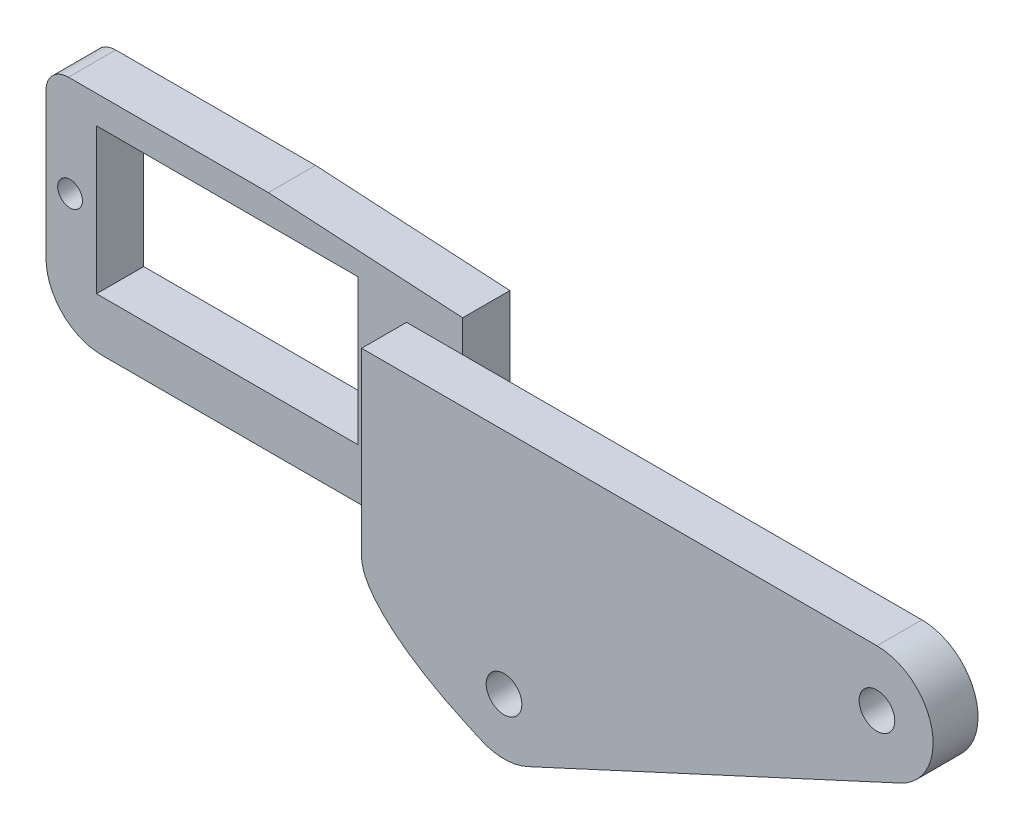
ISO-10303-21;
HEADER;
FILE_DESCRIPTION(('STEP AP214'),'2;1');
FILE_NAME('part.step','',(''),(''),'','','');
FILE_SCHEMA(('AUTOMOTIVE_DESIGN { 1 0 10303 214 1 1 1 1 }'));
ENDSEC;
DATA;
#1=APPLICATION_CONTEXT('core data for automotive mechanical design processes');
#2=APPLICATION_PROTOCOL_DEFINITION('international standard','automotive_design',2000,#1);
#3=PRODUCT_CONTEXT('',#1,'mechanical');
#4=PRODUCT('Part','Part','',(#3));
#5=PRODUCT_RELATED_PRODUCT_CATEGORY('part','',(#4));
#6=PRODUCT_DEFINITION_FORMATION('','',#4);
#7=PRODUCT_DEFINITION_CONTEXT('part definition',#1,'design');
#8=PRODUCT_DEFINITION('design','',#6,#7);
#9=PRODUCT_DEFINITION_SHAPE('','',#8);
#10=(LENGTH_UNIT() NAMED_UNIT(*) SI_UNIT(.MILLI.,.METRE.));
#11=(NAMED_UNIT(*) PLANE_ANGLE_UNIT() SI_UNIT($,.RADIAN.));
#12=(NAMED_UNIT(*) SI_UNIT($,.STERADIAN.) SOLID_ANGLE_UNIT());
#13=UNCERTAINTY_MEASURE_WITH_UNIT(LENGTH_MEASURE(1.E-05),#10,'distance_accuracy_value','');
#14=(GEOMETRIC_REPRESENTATION_CONTEXT(3) GLOBAL_UNCERTAINTY_ASSIGNED_CONTEXT((#13)) GLOBAL_UNIT_ASSIGNED_CONTEXT((#10,
#11,#12)) REPRESENTATION_CONTEXT('',''));
#15=CARTESIAN_POINT('',(0.,0.,0.));
#16=DIRECTION('',(0.,0.,1.));
#17=DIRECTION('',(1.,0.,0.));
#18=AXIS2_PLACEMENT_3D('',#15,#16,#17);
#19=CARTESIAN_POINT('',(-44.44,-11.1,2.50000000000005));
#20=DIRECTION('',(0.,0.,-1.));
#21=DIRECTION('',(1.,0.,0.));
#22=AXIS2_PLACEMENT_3D('',#19,#20,#21);
#23=PLANE('',#22);
#24=CARTESIAN_POINT('',(-14.4900000000001,-0.060000000000001,2.49999999999984));
#25=DIRECTION('',(0.,0.,1.));
#26=DIRECTION('',(1.,0.,0.));
#27=AXIS2_PLACEMENT_3D('',#24,#25,#26);
#28=CIRCLE('',#27,1.1);
#29=CARTESIAN_POINT('',(-13.3900000000001,-0.060000000000001,2.49999999999983));
#30=VERTEX_POINT('',#29);
#31=EDGE_CURVE('E209',#30,#30,#28,.F.);
#32=ORIENTED_EDGE('',*,*,#31,.T.);
#33=EDGE_LOOP('',(#32));
#34=FACE_BOUND('',#33,.T.);
#35=DIRECTION('',(-1.,0.,0.));
#36=VECTOR('',#35,1.);
#37=CARTESIAN_POINT('',(-44.44,8.85,2.50000000000005));
#38=LINE('',#37,#36);
#39=CARTESIAN_POINT('',(-24.64,8.85,2.49999999999991));
#40=VERTEX_POINT('',#39);
#41=CARTESIAN_POINT('',(-42.44,8.85,2.50000000000003));
#42=VERTEX_POINT('',#41);
#43=EDGE_CURVE('E178',#40,#42,#38,.T.);
#44=ORIENTED_EDGE('',*,*,#43,.T.);
#45=CARTESIAN_POINT('',(-42.44,6.85,2.50000000000003));
#46=DIRECTION('',(0.,0.,1.));
#47=DIRECTION('',(1.,0.,0.));
#48=AXIS2_PLACEMENT_3D('',#45,#46,#47);
#49=CIRCLE('',#48,2.);
#50=CARTESIAN_POINT('',(-44.44,6.85,2.50000000000005));
#51=VERTEX_POINT('',#50);
#52=EDGE_CURVE('E12',#51,#42,#49,.F.);
#53=ORIENTED_EDGE('',*,*,#52,.F.);
#54=DIRECTION('',(0.,-1.,0.));
#55=VECTOR('',#54,1.);
#56=CARTESIAN_POINT('',(-44.44,-11.1,2.50000000000005));
#57=LINE('',#56,#55);
#58=CARTESIAN_POINT('',(-44.44,-6.1,2.50000000000005));
#59=VERTEX_POINT('',#58);
#60=EDGE_CURVE('E444',#51,#59,#57,.T.);
#61=ORIENTED_EDGE('',*,*,#60,.T.);
#62=CARTESIAN_POINT('',(-39.44,-6.1,2.50000000000001));
#63=DIRECTION('',(0.,0.,1.));
#64=DIRECTION('',(1.,0.,0.));
#65=AXIS2_PLACEMENT_3D('',#62,#63,#64);
#66=CIRCLE('',#65,5.);
#67=CARTESIAN_POINT('',(-39.44,-11.1,2.50000000000001));
#68=VERTEX_POINT('',#67);
#69=EDGE_CURVE('E351',#68,#59,#66,.F.);
#70=ORIENTED_EDGE('',*,*,#69,.F.);
#71=DIRECTION('',(1.,0.,0.));
#72=VECTOR('',#71,1.);
#73=CARTESIAN_POINT('',(-44.44,-11.1,2.50000000000005));
#74=LINE('',#73,#72);
#75=CARTESIAN_POINT('',(-12.3399999995454,-11.0924387354627,2.49999999999983));
#76=VERTEX_POINT('',#75);
#77=EDGE_CURVE('E242',#68,#76,#74,.T.);
#78=ORIENTED_EDGE('',*,*,#77,.T.);
#79=DIRECTION('',(0.,1.,0.));
#80=VECTOR('',#79,1.);
#81=CARTESIAN_POINT('',(-12.34,-11.1,2.49999999999983));
#82=LINE('',#81,#80);
#83=CARTESIAN_POINT('',(-12.34,5.,2.49999999999985));
#84=VERTEX_POINT('',#83);
#85=EDGE_CURVE('E213',#76,#84,#82,.T.);
#86=ORIENTED_EDGE('',*,*,#85,.T.);
#87=DIRECTION('',(-1.,0.,0.));
#88=VECTOR('',#87,1.);
#89=CARTESIAN_POINT('',(-33.54,5.,2.5));
#90=LINE('',#89,#88);
#91=CARTESIAN_POINT('',(-7.34000000000002,5.,2.49999999999979));
#92=VERTEX_POINT('',#91);
#93=EDGE_CURVE('E402',#92,#84,#90,.T.);
#94=ORIENTED_EDGE('',*,*,#93,.F.);
#95=DIRECTION('',(0.,1.,0.));
#96=VECTOR('',#95,1.);
#97=CARTESIAN_POINT('',(-7.34000000000002,-11.1,2.49999999999979));
#98=LINE('',#97,#96);
#99=CARTESIAN_POINT('',(-7.34000000000005,7.85,2.49999999999979));
#100=VERTEX_POINT('',#99);
#101=EDGE_CURVE('E496',#92,#100,#98,.T.);
#102=ORIENTED_EDGE('',*,*,#101,.T.);
#103=DIRECTION('',(-0.998333554368019,0.0577071418709838,0.));
#104=VECTOR('',#103,1.);
#105=CARTESIAN_POINT('',(-7.34000000000008,7.85,2.49999999999979));
#106=LINE('',#105,#104);
#107=EDGE_CURVE('E193',#100,#40,#106,.T.);
#108=ORIENTED_EDGE('',*,*,#107,.T.);
#109=EDGE_LOOP('',(#44,#53,#61,#70,#78,#86,#94,#102,#108));
#110=FACE_BOUND('',#109,.T.);
#111=DIRECTION('',(1.,0.,0.));
#112=VECTOR('',#111,1.);
#113=CARTESIAN_POINT('',(-39.94,6.35,2.50000000000002));
#114=LINE('',#113,#112);
#115=CARTESIAN_POINT('',(-39.9400000000001,6.35,2.50000000000002));
#116=VERTEX_POINT('',#115);
#117=CARTESIAN_POINT('',(-16.64,6.35,2.49999999999985));
#118=VERTEX_POINT('',#117);
#119=EDGE_CURVE('E484',#116,#118,#114,.T.);
#120=ORIENTED_EDGE('',*,*,#119,.T.);
#121=DIRECTION('',(0.,-1.,0.));
#122=VECTOR('',#121,1.);
#123=CARTESIAN_POINT('',(-16.64,6.35,2.49999999999985));
#124=LINE('',#123,#122);
#125=CARTESIAN_POINT('',(-16.64,-6.6,2.49999999999985));
#126=VERTEX_POINT('',#125);
#127=EDGE_CURVE('E480',#118,#126,#124,.T.);
#128=ORIENTED_EDGE('',*,*,#127,.T.);
#129=DIRECTION('',(-1.,0.,0.));
#130=VECTOR('',#129,1.);
#131=CARTESIAN_POINT('',(-39.94,-6.6,2.50000000000002));
#132=LINE('',#131,#130);
#133=CARTESIAN_POINT('',(-39.94,-6.6,2.50000000000002));
#134=VERTEX_POINT('',#133);
#135=EDGE_CURVE('E476',#126,#134,#132,.T.);
#136=ORIENTED_EDGE('',*,*,#135,.T.);
#137=DIRECTION('',(0.,1.,0.));
#138=VECTOR('',#137,1.);
#139=CARTESIAN_POINT('',(-39.94,6.35,2.50000000000002));
#140=LINE('',#139,#138);
#141=EDGE_CURVE('E488',#134,#116,#140,.T.);
#142=ORIENTED_EDGE('',*,*,#141,.T.);
#143=EDGE_LOOP('',(#120,#128,#136,#142));
#144=FACE_BOUND('',#143,.T.);
#145=CARTESIAN_POINT('',(-42.3000000000001,-0.060000000000001,2.50000000000003));
#146=DIRECTION('',(0.,0.,1.));
#147=DIRECTION('',(1.,0.,0.));
#148=AXIS2_PLACEMENT_3D('',#145,#146,#147);
#149=CIRCLE('',#148,1.1);
#150=CARTESIAN_POINT('',(-41.2000000000001,-0.060000000000001,2.50000000000002));
#151=VERTEX_POINT('',#150);
#152=EDGE_CURVE('E201',#151,#151,#149,.F.);
#153=ORIENTED_EDGE('',*,*,#152,.T.);
#154=EDGE_LOOP('',(#153));
#155=FACE_BOUND('',#154,.T.);
#156=ADVANCED_FACE('F45',(#34,#110,#144,#155),#23,.F.);
#157=CARTESIAN_POINT('',(-33.54,0.,2.5));
#158=DIRECTION('',(0.,0.,-1.));
#159=DIRECTION('',(1.,0.,0.));
#160=AXIS2_PLACEMENT_3D('',#157,#158,#159);
#161=PLANE('',#160);
#162=CARTESIAN_POINT('',(0.338098725402507,-15.3296657416879,2.5));
#163=DIRECTION('',(0.,0.,1.));
#164=DIRECTION('',(1.,0.,0.));
#165=AXIS2_PLACEMENT_3D('',#162,#163,#164);
#166=CIRCLE('',#165,1.5875);
#167=CARTESIAN_POINT('',(1.92559872540251,-15.3296657416879,2.5));
#168=VERTEX_POINT('',#167);
#169=EDGE_CURVE('E433',#168,#168,#166,.T.);
#170=ORIENTED_EDGE('',*,*,#169,.T.);
#171=EDGE_LOOP('',(#170));
#172=FACE_BOUND('',#171,.T.);
#173=CARTESIAN_POINT('',(33.54,0.,2.5));
#174=DIRECTION('',(0.,0.,1.));
#175=DIRECTION('',(1.,0.,0.));
#176=AXIS2_PLACEMENT_3D('',#173,#174,#175);
#177=CIRCLE('',#176,1.5875);
#178=CARTESIAN_POINT('',(35.1275,0.,2.5));
#179=VERTEX_POINT('',#178);
#180=EDGE_CURVE('E425',#179,#179,#177,.T.);
#181=ORIENTED_EDGE('',*,*,#180,.T.);
#182=EDGE_LOOP('',(#181));
#183=FACE_BOUND('',#182,.T.);
#184=CARTESIAN_POINT('',(-7.34000000000002,-11.1,2.49999999999979));
#185=VERTEX_POINT('',#184);
#186=EDGE_CURVE('E366',#76,#185,#74,.T.);
#187=ORIENTED_EDGE('',*,*,#186,.T.);
#188=EDGE_CURVE('E492',#185,#92,#98,.T.);
#189=ORIENTED_EDGE('',*,*,#188,.T.);
#190=CARTESIAN_POINT('',(33.54,5.,2.5));
#191=VERTEX_POINT('',#190);
#192=EDGE_CURVE('E399',#191,#92,#90,.T.);
#193=ORIENTED_EDGE('',*,*,#192,.F.);
#194=CARTESIAN_POINT('',(33.54,0.,2.5));
#195=DIRECTION('',(0.,0.,1.));
#196=DIRECTION('',(-1.,0.,0.));
#197=AXIS2_PLACEMENT_3D('',#194,#195,#196);
#198=CIRCLE('',#197,5.);
#199=CARTESIAN_POINT('',(35.6359346105671,-4.53949976409591,2.5));
#200=VERTEX_POINT('',#199);
#201=EDGE_CURVE('E406',#200,#191,#198,.T.);
#202=ORIENTED_EDGE('',*,*,#201,.F.);
#203=DIRECTION('',(0.907899952819182,0.419186922113425,0.));
#204=VECTOR('',#203,1.);
#205=CARTESIAN_POINT('',(2.43403333596963,-19.8691655057838,2.5));
#206=LINE('',#205,#204);
#207=CARTESIAN_POINT('',(2.43403333596963,-19.8691655057838,2.5));
#208=VERTEX_POINT('',#207);
#209=EDGE_CURVE('E409',#208,#200,#206,.T.);
#210=ORIENTED_EDGE('',*,*,#209,.F.);
#211=CARTESIAN_POINT('',(0.338098725402507,-15.3296657416879,2.5));
#212=DIRECTION('',(0.,0.,1.));
#213=DIRECTION('',(1.,0.,0.));
#214=AXIS2_PLACEMENT_3D('',#211,#212,#213);
#215=CIRCLE('',#214,5.);
#216=CARTESIAN_POINT('',(-1.72317137567157,-19.8850104674379,2.5));
#217=VERTEX_POINT('',#216);
#218=EDGE_CURVE('E413',#217,#208,#215,.T.);
#219=ORIENTED_EDGE('',*,*,#218,.F.);
#220=DIRECTION('',(0.911068945149994,-0.412254020214816,0.));
#221=VECTOR('',#220,1.);
#222=CARTESIAN_POINT('',(-1.72317137567157,-19.8850104674379,2.5));
#223=LINE('',#222,#221);
#224=CARTESIAN_POINT('',(-3.05028618193337,-19.2844978310666,2.5));
#225=VERTEX_POINT('',#224);
#226=EDGE_CURVE('E417',#225,#217,#223,.T.);
#227=ORIENTED_EDGE('',*,*,#226,.F.);
#228=CARTESIAN_POINT('',(-12.34,-11.0848773247167,2.50000000000005));
#229=CARTESIAN_POINT('',(-12.34,-15.0809500221655,2.50000000000003));
#230=CARTESIAN_POINT('',(-3.05028618193337,-19.2844978310666,2.49999999999995));
#231=(BOUNDED_CURVE() B_SPLINE_CURVE(2,(#228,#229,#230),.UNSPECIFIED.,.F.,
.F.) B_SPLINE_CURVE_WITH_KNOTS((3,3),(0.,1.),
.UNSPECIFIED.) CURVE() GEOMETRIC_REPRESENTATION_ITEM() RATIONAL_B_SPLINE_CURVE((1.,
0.840313637939673,1.)) REPRESENTATION_ITEM(''));
#232=EDGE_CURVE('E340',#76,#225,#231,.T.);
#233=ORIENTED_EDGE('',*,*,#232,.F.);
#234=EDGE_LOOP('',(#187,#189,#193,#202,#210,#219,#227,#233));
#235=FACE_BOUND('',#234,.T.);
#236=ADVANCED_FACE('F258',(#172,#183,#235),#161,.T.);
#237=CARTESIAN_POINT('',(-33.54,5.,6.5));
#238=DIRECTION('',(0.,1.,0.));
#239=DIRECTION('',(0.,0.,-1.));
#240=AXIS2_PLACEMENT_3D('',#237,#238,#239);
#241=PLANE('',#240);
#242=DIRECTION('',(-1.,0.,0.));
#243=VECTOR('',#242,1.);
#244=CARTESIAN_POINT('',(-33.54,5.,6.5));
#245=LINE('',#244,#243);
#246=CARTESIAN_POINT('',(33.54,5.,6.5));
#247=VERTEX_POINT('',#246);
#248=CARTESIAN_POINT('',(-12.34,5.,6.49999999999985));
#249=VERTEX_POINT('',#248);
#250=EDGE_CURVE('E381',#247,#249,#245,.T.);
#251=ORIENTED_EDGE('',*,*,#250,.F.);
#252=DIRECTION('',(0.,0.,-1.));
#253=VECTOR('',#252,1.);
#254=CARTESIAN_POINT('',(33.54,5.,6.5));
#255=LINE('',#254,#253);
#256=EDGE_CURVE('E369',#247,#191,#255,.T.);
#257=ORIENTED_EDGE('',*,*,#256,.T.);
#258=ORIENTED_EDGE('',*,*,#192,.T.);
#259=ORIENTED_EDGE('',*,*,#93,.T.);
#260=DIRECTION('',(0.,0.,1.));
#261=VECTOR('',#260,1.);
#262=CARTESIAN_POINT('',(-12.34,5.,2.49999999999985));
#263=LINE('',#262,#261);
#264=EDGE_CURVE('E219',#84,#249,#263,.T.);
#265=ORIENTED_EDGE('',*,*,#264,.T.);
#266=EDGE_LOOP('',(#251,#257,#258,#259,#265));
#267=FACE_BOUND('',#266,.T.);
#268=ADVANCED_FACE('F261',(#267),#241,.T.);
#269=CARTESIAN_POINT('',(-1.72317137567157,-19.8850104674379,6.5));
#270=DIRECTION('',(-0.412254020214816,-0.911068945149994,0.));
#271=DIRECTION('',(0.911068945149994,-0.412254020214816,0.));
#272=AXIS2_PLACEMENT_3D('',#269,#270,#271);
#273=PLANE('',#272);
#274=ORIENTED_EDGE('',*,*,#226,.T.);
#275=DIRECTION('',(0.,0.,-1.));
#276=VECTOR('',#275,1.);
#277=CARTESIAN_POINT('',(-1.72317137567157,-19.8850104674379,6.5));
#278=LINE('',#277,#276);
#279=CARTESIAN_POINT('',(-1.72317137567157,-19.8850104674379,6.5));
#280=VERTEX_POINT('',#279);
#281=EDGE_CURVE('E378',#280,#217,#278,.T.);
#282=ORIENTED_EDGE('',*,*,#281,.F.);
#283=DIRECTION('',(0.911068945149994,-0.412254020214816,0.));
#284=VECTOR('',#283,1.);
#285=CARTESIAN_POINT('',(-1.72317137567157,-19.8850104674379,6.5));
#286=LINE('',#285,#284);
#287=CARTESIAN_POINT('',(-3.05028618193334,-19.2844978310666,6.5));
#288=VERTEX_POINT('',#287);
#289=EDGE_CURVE('E396',#288,#280,#286,.T.);
#290=ORIENTED_EDGE('',*,*,#289,.F.);
#291=CARTESIAN_POINT('',(-3.05028618193337,-19.2844978310666,2.29999999999972));
#292=CARTESIAN_POINT('',(-3.05028618193337,-19.2844978310666,3.76666666666648));
#293=CARTESIAN_POINT('',(-3.05028618193334,-19.2844978310666,5.23333333333325));
#294=CARTESIAN_POINT('',(-3.05028618193334,-19.2844978310666,6.70000000000001));
#295=(BOUNDED_CURVE() B_SPLINE_CURVE(3,(#291,#292,#293,#294),.UNSPECIFIED.,.F.,
.F.) B_SPLINE_CURVE_WITH_KNOTS((4,4),(-0.00420000000000029,0.000200000000000002),
.UNSPECIFIED.) CURVE() GEOMETRIC_REPRESENTATION_ITEM() RATIONAL_B_SPLINE_CURVE((1.,1.,1.,1.)) REPRESENTATION_ITEM(''));
#296=EDGE_CURVE('E349',#225,#288,#295,.T.);
#297=ORIENTED_EDGE('',*,*,#296,.F.);
#298=EDGE_LOOP('',(#274,#282,#290,#297));
#299=FACE_BOUND('',#298,.T.);
#300=ADVANCED_FACE('F256',(#299),#273,.T.);
#301=CARTESIAN_POINT('',(-33.54,0.,6.5));
#302=DIRECTION('',(0.,0.,-1.));
#303=DIRECTION('',(1.,0.,0.));
#304=AXIS2_PLACEMENT_3D('',#301,#302,#303);
#305=PLANE('',#304);
#306=CARTESIAN_POINT('',(33.54,0.,6.5));
#307=DIRECTION('',(0.,0.,1.));
#308=DIRECTION('',(1.,0.,0.));
#309=AXIS2_PLACEMENT_3D('',#306,#307,#308);
#310=CIRCLE('',#309,1.5875);
#311=CARTESIAN_POINT('',(35.1275,0.,6.5));
#312=VERTEX_POINT('',#311);
#313=EDGE_CURVE('E421',#312,#312,#310,.T.);
#314=ORIENTED_EDGE('',*,*,#313,.F.);
#315=EDGE_LOOP('',(#314));
#316=FACE_BOUND('',#315,.T.);
#317=CARTESIAN_POINT('',(0.338098725402507,-15.3296657416879,6.5));
#318=DIRECTION('',(0.,0.,1.));
#319=DIRECTION('',(1.,0.,0.));
#320=AXIS2_PLACEMENT_3D('',#317,#318,#319);
#321=CIRCLE('',#320,1.5875);
#322=CARTESIAN_POINT('',(1.92559872540251,-15.3296657416879,6.5));
#323=VERTEX_POINT('',#322);
#324=EDGE_CURVE('E429',#323,#323,#321,.T.);
#325=ORIENTED_EDGE('',*,*,#324,.F.);
#326=EDGE_LOOP('',(#325));
#327=FACE_BOUND('',#326,.T.);
#328=ORIENTED_EDGE('',*,*,#289,.T.);
#329=CARTESIAN_POINT('',(0.338098725402507,-15.3296657416879,6.5));
#330=DIRECTION('',(0.,0.,1.));
#331=DIRECTION('',(1.,0.,0.));
#332=AXIS2_PLACEMENT_3D('',#329,#330,#331);
#333=CIRCLE('',#332,5.);
#334=CARTESIAN_POINT('',(2.43403333596963,-19.8691655057838,6.5));
#335=VERTEX_POINT('',#334);
#336=EDGE_CURVE('E392',#280,#335,#333,.T.);
#337=ORIENTED_EDGE('',*,*,#336,.T.);
#338=DIRECTION('',(0.907899952819182,0.419186922113425,0.));
#339=VECTOR('',#338,1.);
#340=CARTESIAN_POINT('',(2.43403333596963,-19.8691655057838,6.5));
#341=LINE('',#340,#339);
#342=CARTESIAN_POINT('',(35.6359346105671,-4.53949976409591,6.5));
#343=VERTEX_POINT('',#342);
#344=EDGE_CURVE('E388',#335,#343,#341,.T.);
#345=ORIENTED_EDGE('',*,*,#344,.T.);
#346=CARTESIAN_POINT('',(33.54,0.,6.5));
#347=DIRECTION('',(0.,0.,1.));
#348=DIRECTION('',(-1.,0.,0.));
#349=AXIS2_PLACEMENT_3D('',#346,#347,#348);
#350=CIRCLE('',#349,5.);
#351=EDGE_CURVE('E385',#343,#247,#350,.T.);
#352=ORIENTED_EDGE('',*,*,#351,.T.);
#353=ORIENTED_EDGE('',*,*,#250,.T.);
#354=DIRECTION('',(0.,-1.,0.));
#355=VECTOR('',#354,1.);
#356=CARTESIAN_POINT('',(-12.34,5.,6.49999999999985));
#357=LINE('',#356,#355);
#358=CARTESIAN_POINT('',(-12.34,-11.0848773247167,6.49999999999996));
#359=VERTEX_POINT('',#358);
#360=EDGE_CURVE('E222',#249,#359,#357,.T.);
#361=ORIENTED_EDGE('',*,*,#360,.T.);
#362=CARTESIAN_POINT('',(-3.05028618193334,-19.2844978310666,6.49999999999996));
#363=CARTESIAN_POINT('',(-12.34,-15.0809500221655,6.50000000000003));
#364=CARTESIAN_POINT('',(-12.34,-11.0848773247167,6.50000000000004));
#365=(BOUNDED_CURVE() B_SPLINE_CURVE(2,(#362,#363,#364),.UNSPECIFIED.,.F.,
.F.) B_SPLINE_CURVE_WITH_KNOTS((3,3),(0.,1.),
.UNSPECIFIED.) CURVE() GEOMETRIC_REPRESENTATION_ITEM() RATIONAL_B_SPLINE_CURVE((1.,
0.840313637939673,1.)) REPRESENTATION_ITEM(''));
#366=EDGE_CURVE('E236',#288,#359,#365,.T.);
#367=ORIENTED_EDGE('',*,*,#366,.F.);
#368=EDGE_LOOP('',(#328,#337,#345,#352,#353,#361,#367));
#369=FACE_BOUND('',#368,.T.);
#370=ADVANCED_FACE('F245',(#316,#327,#369),#305,.F.);
#371=CARTESIAN_POINT('',(33.54,0.,6.5));
#372=DIRECTION('',(0.,0.,-1.));
#373=DIRECTION('',(1.,0.,0.));
#374=AXIS2_PLACEMENT_3D('',#371,#372,#373);
#375=CYLINDRICAL_SURFACE('',#374,5.);
#376=ORIENTED_EDGE('',*,*,#256,.F.);
#377=ORIENTED_EDGE('',*,*,#351,.F.);
#378=DIRECTION('',(0.,0.,-1.));
#379=VECTOR('',#378,1.);
#380=CARTESIAN_POINT('',(35.6359346105671,-4.53949976409591,6.5));
#381=LINE('',#380,#379);
#382=EDGE_CURVE('E372',#343,#200,#381,.T.);
#383=ORIENTED_EDGE('',*,*,#382,.T.);
#384=ORIENTED_EDGE('',*,*,#201,.T.);
#385=EDGE_LOOP('',(#376,#377,#383,#384));
#386=FACE_BOUND('',#385,.T.);
#387=ADVANCED_FACE('F255',(#386),#375,.T.);
#388=CARTESIAN_POINT('',(2.43403333596963,-19.8691655057838,6.5));
#389=DIRECTION('',(0.419186922113425,-0.907899952819183,0.));
#390=DIRECTION('',(0.907899952819183,0.419186922113425,0.));
#391=AXIS2_PLACEMENT_3D('',#388,#389,#390);
#392=PLANE('',#391);
#393=ORIENTED_EDGE('',*,*,#382,.F.);
#394=ORIENTED_EDGE('',*,*,#344,.F.);
#395=DIRECTION('',(0.,0.,-1.));
#396=VECTOR('',#395,1.);
#397=CARTESIAN_POINT('',(2.43403333596963,-19.8691655057838,6.5));
#398=LINE('',#397,#396);
#399=EDGE_CURVE('E375',#335,#208,#398,.T.);
#400=ORIENTED_EDGE('',*,*,#399,.T.);
#401=ORIENTED_EDGE('',*,*,#209,.T.);
#402=EDGE_LOOP('',(#393,#394,#400,#401));
#403=FACE_BOUND('',#402,.T.);
#404=ADVANCED_FACE('F267',(#403),#392,.T.);
#405=CARTESIAN_POINT('',(0.338098725402507,-15.3296657416879,6.5));
#406=DIRECTION('',(0.,0.,-1.));
#407=DIRECTION('',(1.,0.,0.));
#408=AXIS2_PLACEMENT_3D('',#405,#406,#407);
#409=CYLINDRICAL_SURFACE('',#408,5.);
#410=ORIENTED_EDGE('',*,*,#399,.F.);
#411=ORIENTED_EDGE('',*,*,#336,.F.);
#412=ORIENTED_EDGE('',*,*,#281,.T.);
#413=ORIENTED_EDGE('',*,*,#218,.T.);
#414=EDGE_LOOP('',(#410,#411,#412,#413));
#415=FACE_BOUND('',#414,.T.);
#416=ADVANCED_FACE('F271',(#415),#409,.T.);
#417=CARTESIAN_POINT('',(0.338098725402507,-15.3296657416879,6.5));
#418=DIRECTION('',(0.,0.,-1.));
#419=DIRECTION('',(1.,0.,0.));
#420=AXIS2_PLACEMENT_3D('',#417,#418,#419);
#421=CYLINDRICAL_SURFACE('',#420,1.5875);
#422=ORIENTED_EDGE('',*,*,#324,.T.);
#423=EDGE_LOOP('',(#422));
#424=FACE_BOUND('',#423,.T.);
#425=ORIENTED_EDGE('',*,*,#169,.F.);
#426=EDGE_LOOP('',(#425));
#427=FACE_BOUND('',#426,.T.);
#428=ADVANCED_FACE('F274',(#424,#427),#421,.F.);
#429=CARTESIAN_POINT('',(33.54,0.,6.5));
#430=DIRECTION('',(0.,0.,-1.));
#431=DIRECTION('',(1.,0.,0.));
#432=AXIS2_PLACEMENT_3D('',#429,#430,#431);
#433=CYLINDRICAL_SURFACE('',#432,1.5875);
#434=ORIENTED_EDGE('',*,*,#313,.T.);
#435=EDGE_LOOP('',(#434));
#436=FACE_BOUND('',#435,.T.);
#437=ORIENTED_EDGE('',*,*,#180,.F.);
#438=EDGE_LOOP('',(#437));
#439=FACE_BOUND('',#438,.T.);
#440=ADVANCED_FACE('F587',(#436,#439),#433,.F.);
#441=CARTESIAN_POINT('',(-44.44,-11.1,2.50000000000005));
#442=DIRECTION('',(0.,1.,0.));
#443=DIRECTION('',(-1.,0.,0.));
#444=AXIS2_PLACEMENT_3D('',#441,#442,#443);
#445=PLANE('',#444);
#446=DIRECTION('',(1.,0.,0.));
#447=VECTOR('',#446,1.);
#448=CARTESIAN_POINT('',(-44.4400000000001,-11.1,-1.69999999999995));
#449=LINE('',#448,#447);
#450=CARTESIAN_POINT('',(-39.4400000000001,-11.1,-1.69999999999999));
#451=VERTEX_POINT('',#450);
#452=CARTESIAN_POINT('',(-7.34000000000005,-11.1,-1.70000000000021));
#453=VERTEX_POINT('',#452);
#454=EDGE_CURVE('E437',#451,#453,#449,.T.);
#455=ORIENTED_EDGE('',*,*,#454,.T.);
#456=DIRECTION('',(0.,0.,1.));
#457=VECTOR('',#456,1.);
#458=CARTESIAN_POINT('',(-7.34000000000005,-11.1,-1.70000000000021));
#459=LINE('',#458,#457);
#460=EDGE_CURVE('E500',#453,#185,#459,.T.);
#461=ORIENTED_EDGE('',*,*,#460,.T.);
#462=ORIENTED_EDGE('',*,*,#186,.F.);
#463=ORIENTED_EDGE('',*,*,#77,.F.);
#464=DIRECTION('',(0.,0.,-1.));
#465=VECTOR('',#464,1.);
#466=CARTESIAN_POINT('',(-39.44,-11.1,2.50000000000001));
#467=LINE('',#466,#465);
#468=EDGE_CURVE('E354',#451,#68,#467,.F.);
#469=ORIENTED_EDGE('',*,*,#468,.F.);
#470=EDGE_LOOP('',(#455,#461,#462,#463,#469));
#471=FACE_BOUND('',#470,.T.);
#472=ADVANCED_FACE('F583',(#471),#445,.F.);
#473=CARTESIAN_POINT('',(-44.4400000000001,-11.1,-1.69999999999995));
#474=DIRECTION('',(0.,0.,1.));
#475=DIRECTION('',(-1.,0.,0.));
#476=AXIS2_PLACEMENT_3D('',#473,#474,#475);
#477=PLANE('',#476);
#478=CARTESIAN_POINT('',(-42.3000000000001,-0.060000000000001,-1.70000000000026));
#479=DIRECTION('',(0.,0.,1.));
#480=DIRECTION('',(1.,0.,0.));
#481=AXIS2_PLACEMENT_3D('',#478,#479,#480);
#482=CIRCLE('',#481,1.1);
#483=CARTESIAN_POINT('',(-41.2000000000001,-0.060000000000001,-1.70000000000026));
#484=VERTEX_POINT('',#483);
#485=EDGE_CURVE('E197',#484,#484,#482,.T.);
#486=ORIENTED_EDGE('',*,*,#485,.T.);
#487=EDGE_LOOP('',(#486));
#488=FACE_BOUND('',#487,.T.);
#489=CARTESIAN_POINT('',(-14.4900000000001,-0.060000000000001,-1.70000000000026));
#490=DIRECTION('',(0.,0.,1.));
#491=DIRECTION('',(1.,0.,0.));
#492=AXIS2_PLACEMENT_3D('',#489,#490,#491);
#493=CIRCLE('',#492,1.1);
#494=CARTESIAN_POINT('',(-13.3900000000001,-0.060000000000001,-1.70000000000026));
#495=VERTEX_POINT('',#494);
#496=EDGE_CURVE('E205',#495,#495,#493,.T.);
#497=ORIENTED_EDGE('',*,*,#496,.T.);
#498=EDGE_LOOP('',(#497));
#499=FACE_BOUND('',#498,.T.);
#500=DIRECTION('',(1.,0.,0.));
#501=VECTOR('',#500,1.);
#502=CARTESIAN_POINT('',(-39.9400000000001,-6.6,-1.69999999999998));
#503=LINE('',#502,#501);
#504=CARTESIAN_POINT('',(-39.9400000000003,-6.6,-1.69999999999998));
#505=VERTEX_POINT('',#504);
#506=CARTESIAN_POINT('',(-16.6400000000001,-6.6,-1.70000000000015));
#507=VERTEX_POINT('',#506);
#508=EDGE_CURVE('E456',#505,#507,#503,.T.);
#509=ORIENTED_EDGE('',*,*,#508,.T.);
#510=DIRECTION('',(0.,1.,0.));
#511=VECTOR('',#510,1.);
#512=CARTESIAN_POINT('',(-16.6400000000001,6.35,-1.70000000000015));
#513=LINE('',#512,#511);
#514=CARTESIAN_POINT('',(-16.64,6.35,-1.70000000000015));
#515=VERTEX_POINT('',#514);
#516=EDGE_CURVE('E460',#507,#515,#513,.T.);
#517=ORIENTED_EDGE('',*,*,#516,.T.);
#518=DIRECTION('',(-1.,0.,0.));
#519=VECTOR('',#518,1.);
#520=CARTESIAN_POINT('',(-39.9400000000001,6.35,-1.69999999999998));
#521=LINE('',#520,#519);
#522=CARTESIAN_POINT('',(-39.9400000000003,6.35,-1.69999999999998));
#523=VERTEX_POINT('',#522);
#524=EDGE_CURVE('E448',#515,#523,#521,.T.);
#525=ORIENTED_EDGE('',*,*,#524,.T.);
#526=DIRECTION('',(0.,-1.,0.));
#527=VECTOR('',#526,1.);
#528=CARTESIAN_POINT('',(-39.9400000000001,6.35,-1.69999999999998));
#529=LINE('',#528,#527);
#530=EDGE_CURVE('E452',#523,#505,#529,.T.);
#531=ORIENTED_EDGE('',*,*,#530,.T.);
#532=EDGE_LOOP('',(#509,#517,#525,#531));
#533=FACE_BOUND('',#532,.T.);
#534=DIRECTION('',(0.,-1.,0.));
#535=VECTOR('',#534,1.);
#536=CARTESIAN_POINT('',(-7.34000000000005,-11.1,-1.70000000000021));
#537=LINE('',#536,#535);
#538=CARTESIAN_POINT('',(-7.34000000000005,7.85,-1.70000000000026));
#539=VERTEX_POINT('',#538);
#540=EDGE_CURVE('E227',#539,#453,#537,.T.);
#541=ORIENTED_EDGE('',*,*,#540,.T.);
#542=ORIENTED_EDGE('',*,*,#454,.F.);
#543=CARTESIAN_POINT('',(-39.4400000000001,-6.1,-1.69999999999999));
#544=DIRECTION('',(0.,0.,-1.));
#545=DIRECTION('',(-1.,0.,0.));
#546=AXIS2_PLACEMENT_3D('',#543,#544,#545);
#547=CIRCLE('',#546,5.);
#548=CARTESIAN_POINT('',(-44.4400000000001,-6.1,-1.69999999999995));
#549=VERTEX_POINT('',#548);
#550=EDGE_CURVE('E357',#549,#451,#547,.F.);
#551=ORIENTED_EDGE('',*,*,#550,.F.);
#552=DIRECTION('',(0.,1.,0.));
#553=VECTOR('',#552,1.);
#554=CARTESIAN_POINT('',(-44.4400000000001,-11.1,-1.69999999999995));
#555=LINE('',#554,#553);
#556=CARTESIAN_POINT('',(-44.4400000000001,6.85,-1.69999999999995));
#557=VERTEX_POINT('',#556);
#558=EDGE_CURVE('E441',#549,#557,#555,.T.);
#559=ORIENTED_EDGE('',*,*,#558,.T.);
#560=CARTESIAN_POINT('',(-42.44,6.85,-1.69999999999997));
#561=DIRECTION('',(0.,0.,-1.));
#562=DIRECTION('',(-1.,0.,0.));
#563=AXIS2_PLACEMENT_3D('',#560,#561,#562);
#564=CIRCLE('',#563,2.);
#565=CARTESIAN_POINT('',(-42.44,8.85,-1.70000000000026));
#566=VERTEX_POINT('',#565);
#567=EDGE_CURVE('E191',#566,#557,#564,.F.);
#568=ORIENTED_EDGE('',*,*,#567,.F.);
#569=DIRECTION('',(1.,0.,0.));
#570=VECTOR('',#569,1.);
#571=CARTESIAN_POINT('',(-44.4400000000001,8.85,-1.70000000000026));
#572=LINE('',#571,#570);
#573=CARTESIAN_POINT('',(-24.64,8.85,-1.70000000000026));
#574=VERTEX_POINT('',#573);
#575=EDGE_CURVE('E175',#566,#574,#572,.T.);
#576=ORIENTED_EDGE('',*,*,#575,.T.);
#577=DIRECTION('',(0.998333554368019,-0.0577071418709838,0.));
#578=VECTOR('',#577,1.);
#579=CARTESIAN_POINT('',(-7.34000000000005,7.85,-1.70000000000026));
#580=LINE('',#579,#578);
#581=EDGE_CURVE('E181',#574,#539,#580,.T.);
#582=ORIENTED_EDGE('',*,*,#581,.T.);
#583=EDGE_LOOP('',(#541,#542,#551,#559,#568,#576,#582));
#584=FACE_BOUND('',#583,.T.);
#585=ADVANCED_FACE('F189',(#488,#499,#533,#584),#477,.F.);
#586=CARTESIAN_POINT('',(-44.44,0.,5.00000000000031));
#587=DIRECTION('',(1.,0.,0.));
#588=DIRECTION('',(0.,0.,1.));
#589=AXIS2_PLACEMENT_3D('',#586,#587,#588);
#590=PLANE('',#589);
#591=ORIENTED_EDGE('',*,*,#558,.F.);
#592=DIRECTION('',(0.,0.,-1.));
#593=VECTOR('',#592,1.);
#594=CARTESIAN_POINT('',(-44.44,-6.1,5.00000000000031));
#595=LINE('',#594,#593);
#596=EDGE_CURVE('E360',#59,#549,#595,.T.);
#597=ORIENTED_EDGE('',*,*,#596,.F.);
#598=ORIENTED_EDGE('',*,*,#60,.F.);
#599=DIRECTION('',(0.,0.,-1.));
#600=VECTOR('',#599,1.);
#601=CARTESIAN_POINT('',(-44.44,6.85,5.00000000000031));
#602=LINE('',#601,#600);
#603=EDGE_CURVE('E53',#557,#51,#602,.F.);
#604=ORIENTED_EDGE('',*,*,#603,.F.);
#605=EDGE_LOOP('',(#591,#597,#598,#604));
#606=FACE_BOUND('',#605,.T.);
#607=ADVANCED_FACE('F576',(#606),#590,.F.);
#608=CARTESIAN_POINT('',(-39.9400000000003,6.35,-28.3569409347734));
#609=DIRECTION('',(-1.,0.,0.));
#610=DIRECTION('',(0.,0.,-1.));
#611=AXIS2_PLACEMENT_3D('',#608,#609,#610);
#612=PLANE('',#611);
#613=ORIENTED_EDGE('',*,*,#530,.F.);
#614=DIRECTION('',(0.,0.,1.));
#615=VECTOR('',#614,1.);
#616=CARTESIAN_POINT('',(-39.9400000000003,6.35,-28.3569409347734));
#617=LINE('',#616,#615);
#618=EDGE_CURVE('E473',#523,#116,#617,.T.);
#619=ORIENTED_EDGE('',*,*,#618,.T.);
#620=ORIENTED_EDGE('',*,*,#141,.F.);
#621=DIRECTION('',(0.,0.,1.));
#622=VECTOR('',#621,1.);
#623=CARTESIAN_POINT('',(-39.9400000000003,-6.6,-28.3569409347734));
#624=LINE('',#623,#622);
#625=EDGE_CURVE('E464',#505,#134,#624,.T.);
#626=ORIENTED_EDGE('',*,*,#625,.F.);
#627=EDGE_LOOP('',(#613,#619,#620,#626));
#628=FACE_BOUND('',#627,.T.);
#629=ADVANCED_FACE('F566',(#628),#612,.F.);
#630=CARTESIAN_POINT('',(-39.9400000000003,-6.6,-28.3569409347734));
#631=DIRECTION('',(0.,-1.,0.));
#632=DIRECTION('',(1.,0.,0.));
#633=AXIS2_PLACEMENT_3D('',#630,#631,#632);
#634=PLANE('',#633);
#635=ORIENTED_EDGE('',*,*,#508,.F.);
#636=ORIENTED_EDGE('',*,*,#625,.T.);
#637=ORIENTED_EDGE('',*,*,#135,.F.);
#638=DIRECTION('',(0.,0.,1.));
#639=VECTOR('',#638,1.);
#640=CARTESIAN_POINT('',(-16.6400000000002,-6.6,-28.3569409347736));
#641=LINE('',#640,#639);
#642=EDGE_CURVE('E467',#507,#126,#641,.T.);
#643=ORIENTED_EDGE('',*,*,#642,.F.);
#644=EDGE_LOOP('',(#635,#636,#637,#643));
#645=FACE_BOUND('',#644,.T.);
#646=ADVANCED_FACE('F562',(#645),#634,.F.);
#647=CARTESIAN_POINT('',(-16.6400000000002,6.35,-28.3569409347736));
#648=DIRECTION('',(1.,0.,0.));
#649=DIRECTION('',(0.,0.,1.));
#650=AXIS2_PLACEMENT_3D('',#647,#648,#649);
#651=PLANE('',#650);
#652=ORIENTED_EDGE('',*,*,#516,.F.);
#653=ORIENTED_EDGE('',*,*,#642,.T.);
#654=ORIENTED_EDGE('',*,*,#127,.F.);
#655=DIRECTION('',(0.,0.,1.));
#656=VECTOR('',#655,1.);
#657=CARTESIAN_POINT('',(-16.6400000000002,6.35,-28.3569409347736));
#658=LINE('',#657,#656);
#659=EDGE_CURVE('E470',#515,#118,#658,.T.);
#660=ORIENTED_EDGE('',*,*,#659,.F.);
#661=EDGE_LOOP('',(#652,#653,#654,#660));
#662=FACE_BOUND('',#661,.T.);
#663=ADVANCED_FACE('F565',(#662),#651,.F.);
#664=CARTESIAN_POINT('',(-39.9400000000003,6.35,-28.3569409347734));
#665=DIRECTION('',(0.,1.,0.));
#666=DIRECTION('',(-1.,0.,0.));
#667=AXIS2_PLACEMENT_3D('',#664,#665,#666);
#668=PLANE('',#667);
#669=ORIENTED_EDGE('',*,*,#524,.F.);
#670=ORIENTED_EDGE('',*,*,#659,.T.);
#671=ORIENTED_EDGE('',*,*,#119,.F.);
#672=ORIENTED_EDGE('',*,*,#618,.F.);
#673=EDGE_LOOP('',(#669,#670,#671,#672));
#674=FACE_BOUND('',#673,.T.);
#675=ADVANCED_FACE('F560',(#674),#668,.F.);
#676=CARTESIAN_POINT('',(-7.34000000000001,0.,5.00000000000005));
#677=DIRECTION('',(-1.,0.,0.));
#678=DIRECTION('',(0.,0.,-1.));
#679=AXIS2_PLACEMENT_3D('',#676,#677,#678);
#680=PLANE('',#679);
#681=ORIENTED_EDGE('',*,*,#101,.F.);
#682=ORIENTED_EDGE('',*,*,#188,.F.);
#683=ORIENTED_EDGE('',*,*,#460,.F.);
#684=ORIENTED_EDGE('',*,*,#540,.F.);
#685=DIRECTION('',(0.,0.,-1.));
#686=VECTOR('',#685,1.);
#687=CARTESIAN_POINT('',(-7.34000000000005,7.85,6.566));
#688=LINE('',#687,#686);
#689=EDGE_CURVE('E180',#100,#539,#688,.T.);
#690=ORIENTED_EDGE('',*,*,#689,.F.);
#691=EDGE_LOOP('',(#681,#682,#683,#684,#690));
#692=FACE_BOUND('',#691,.T.);
#693=ADVANCED_FACE('F556',(#692),#680,.F.);
#694=CARTESIAN_POINT('',(-12.34,0.,5.00000000000009));
#695=DIRECTION('',(-1.,0.,0.));
#696=DIRECTION('',(0.,0.,-1.));
#697=AXIS2_PLACEMENT_3D('',#694,#695,#696);
#698=PLANE('',#697);
#699=ORIENTED_EDGE('',*,*,#360,.F.);
#700=ORIENTED_EDGE('',*,*,#264,.F.);
#701=ORIENTED_EDGE('',*,*,#85,.F.);
#702=CARTESIAN_POINT('',(-12.34,-11.0848773247167,6.7000000000001));
#703=CARTESIAN_POINT('',(-12.34,-11.0848773247167,5.23333333333334));
#704=CARTESIAN_POINT('',(-12.34,-11.0848773247167,3.76666666666658));
#705=CARTESIAN_POINT('',(-12.34,-11.0848773247167,2.29999999999981));
#706=(BOUNDED_CURVE() B_SPLINE_CURVE(3,(#702,#703,#704,#705),.UNSPECIFIED.,.F.,
.F.) B_SPLINE_CURVE_WITH_KNOTS((4,4),(-0.00420000000000029,0.000200000000000002),
.UNSPECIFIED.) CURVE() GEOMETRIC_REPRESENTATION_ITEM() RATIONAL_B_SPLINE_CURVE((1.,1.,1.,1.)) REPRESENTATION_ITEM(''));
#707=EDGE_CURVE('E346',#359,#76,#706,.T.);
#708=ORIENTED_EDGE('',*,*,#707,.F.);
#709=EDGE_LOOP('',(#699,#700,#701,#708));
#710=FACE_BOUND('',#709,.T.);
#711=ADVANCED_FACE('F283',(#710),#698,.T.);
#712=CARTESIAN_POINT('',(-39.44,-6.1,5.00000000000027));
#713=DIRECTION('',(0.,0.,-1.));
#714=DIRECTION('',(1.,0.,0.));
#715=AXIS2_PLACEMENT_3D('',#712,#713,#714);
#716=CYLINDRICAL_SURFACE('',#715,5.);
#717=ORIENTED_EDGE('',*,*,#69,.T.);
#718=ORIENTED_EDGE('',*,*,#596,.T.);
#719=ORIENTED_EDGE('',*,*,#550,.T.);
#720=ORIENTED_EDGE('',*,*,#468,.T.);
#721=EDGE_LOOP('',(#717,#718,#719,#720));
#722=FACE_BOUND('',#721,.T.);
#723=ADVANCED_FACE('F280',(#722),#716,.T.);
#724=CARTESIAN_POINT('',(-3.05028618193337,-19.2844978310666,2.29999999999972));
#725=CARTESIAN_POINT('',(-3.05028618193337,-19.2844978310666,3.76666666666648));
#726=CARTESIAN_POINT('',(-3.05028618193334,-19.2844978310666,5.23333333333325));
#727=CARTESIAN_POINT('',(-3.05028618193334,-19.2844978310666,6.70000000000001));
#728=CARTESIAN_POINT('',(-12.34,-15.0809500221655,2.2999999999998));
#729=CARTESIAN_POINT('',(-12.34,-15.0809500221655,3.76666666666656));
#730=CARTESIAN_POINT('',(-12.34,-15.0809500221655,5.23333333333333));
#731=CARTESIAN_POINT('',(-12.34,-15.0809500221655,6.70000000000009));
#732=CARTESIAN_POINT('',(-12.34,-11.0848773247167,2.29999999999981));
#733=CARTESIAN_POINT('',(-12.34,-11.0848773247167,3.76666666666658));
#734=CARTESIAN_POINT('',(-12.34,-11.0848773247167,5.23333333333334));
#735=CARTESIAN_POINT('',(-12.34,-11.0848773247167,6.7000000000001));
#736=(BOUNDED_SURFACE() B_SPLINE_SURFACE(2,3,((#724,#725,#726,#727),(#728,#729,#730,#731),(#732,
#733,#734,#735)),.UNSPECIFIED.,.F.,.F.,.F.) B_SPLINE_SURFACE_WITH_KNOTS((3,3),(4,4),(0.,1.),
(-0.00420000000000029,0.000200000000000002),
.UNSPECIFIED.) GEOMETRIC_REPRESENTATION_ITEM() RATIONAL_B_SPLINE_SURFACE(((1.,1.,1.,1.),
(0.840313637939673,0.840313637939673,0.840313637939673,0.840313637939673),(1.,1.,1.,1.))) REPRESENTATION_ITEM('') SURFACE());
#737=ORIENTED_EDGE('',*,*,#232,.T.);
#738=ORIENTED_EDGE('',*,*,#296,.T.);
#739=ORIENTED_EDGE('',*,*,#366,.T.);
#740=ORIENTED_EDGE('',*,*,#707,.T.);
#741=EDGE_LOOP('',(#737,#738,#739,#740));
#742=FACE_BOUND('',#741,.T.);
#743=ADVANCED_FACE('F282',(#742),#736,.F.);
#744=CARTESIAN_POINT('',(-14.4900000000001,-0.060000000000001,-1.70000000000026));
#745=DIRECTION('',(0.,0.,-1.));
#746=DIRECTION('',(1.,0.,0.));
#747=AXIS2_PLACEMENT_3D('',#744,#745,#746);
#748=CYLINDRICAL_SURFACE('',#747,1.1);
#749=ORIENTED_EDGE('',*,*,#31,.F.);
#750=EDGE_LOOP('',(#749));
#751=FACE_BOUND('',#750,.T.);
#752=ORIENTED_EDGE('',*,*,#496,.F.);
#753=EDGE_LOOP('',(#752));
#754=FACE_BOUND('',#753,.T.);
#755=ADVANCED_FACE('F289',(#751,#754),#748,.F.);
#756=CARTESIAN_POINT('',(-42.3000000000001,-0.060000000000001,-1.70000000000026));
#757=DIRECTION('',(0.,0.,-1.));
#758=DIRECTION('',(1.,0.,0.));
#759=AXIS2_PLACEMENT_3D('',#756,#757,#758);
#760=CYLINDRICAL_SURFACE('',#759,1.1);
#761=ORIENTED_EDGE('',*,*,#152,.F.);
#762=EDGE_LOOP('',(#761));
#763=FACE_BOUND('',#762,.T.);
#764=ORIENTED_EDGE('',*,*,#485,.F.);
#765=EDGE_LOOP('',(#764));
#766=FACE_BOUND('',#765,.T.);
#767=ADVANCED_FACE('F721',(#763,#766),#760,.F.);
#768=CARTESIAN_POINT('',(-44.44,8.85,6.56600000000058));
#769=DIRECTION('',(0.,-1.,0.));
#770=DIRECTION('',(0.,0.,1.));
#771=AXIS2_PLACEMENT_3D('',#768,#769,#770);
#772=PLANE('',#771);
#773=ORIENTED_EDGE('',*,*,#575,.F.);
#774=DIRECTION('',(0.,0.,-1.));
#775=VECTOR('',#774,1.);
#776=CARTESIAN_POINT('',(-42.44,8.85,6.56600000000056));
#777=LINE('',#776,#775);
#778=EDGE_CURVE('E332',#42,#566,#777,.T.);
#779=ORIENTED_EDGE('',*,*,#778,.F.);
#780=ORIENTED_EDGE('',*,*,#43,.F.);
#781=DIRECTION('',(0.,0.,-1.));
#782=VECTOR('',#781,1.);
#783=CARTESIAN_POINT('',(-24.64,8.85,6.566));
#784=LINE('',#783,#782);
#785=EDGE_CURVE('E60',#40,#574,#784,.T.);
#786=ORIENTED_EDGE('',*,*,#785,.T.);
#787=EDGE_LOOP('',(#773,#779,#780,#786));
#788=FACE_BOUND('',#787,.T.);
#789=ADVANCED_FACE('F173',(#788),#772,.F.);
#790=CARTESIAN_POINT('',(-42.44,6.85,6.56600000000056));
#791=DIRECTION('',(0.,0.,-1.));
#792=DIRECTION('',(1.,0.,0.));
#793=AXIS2_PLACEMENT_3D('',#790,#791,#792);
#794=CYLINDRICAL_SURFACE('',#793,2.);
#795=ORIENTED_EDGE('',*,*,#52,.T.);
#796=ORIENTED_EDGE('',*,*,#778,.T.);
#797=ORIENTED_EDGE('',*,*,#567,.T.);
#798=ORIENTED_EDGE('',*,*,#603,.T.);
#799=EDGE_LOOP('',(#795,#796,#797,#798));
#800=FACE_BOUND('',#799,.T.);
#801=ADVANCED_FACE('F47',(#800),#794,.T.);
#802=CARTESIAN_POINT('',(-7.34000000000005,7.85,6.566));
#803=DIRECTION('',(-0.0577071418709838,-0.998333554368019,0.));
#804=DIRECTION('',(0.998333554368019,-0.0577071418709838,0.));
#805=AXIS2_PLACEMENT_3D('',#802,#803,#804);
#806=PLANE('',#805);
#807=ORIENTED_EDGE('',*,*,#107,.F.);
#808=ORIENTED_EDGE('',*,*,#689,.T.);
#809=ORIENTED_EDGE('',*,*,#581,.F.);
#810=ORIENTED_EDGE('',*,*,#785,.F.);
#811=EDGE_LOOP('',(#807,#808,#809,#810));
#812=FACE_BOUND('',#811,.T.);
#813=ADVANCED_FACE('F184',(#812),#806,.F.);
#814=CLOSED_SHELL('',(#156,#236,#268,#300,#370,#387,#404,#416,#428,#440,#472,#585,#607,#629,
#646,#663,#675,#693,#711,#723,#743,#755,#767,#789,#801,#813));
#815=MANIFOLD_SOLID_BREP('B2',#814);
#816=ADVANCED_BREP_SHAPE_REPRESENTATION('',(#18,#815),#14);
#817=SHAPE_DEFINITION_REPRESENTATION(#9,#816);
ENDSEC;
END-ISO-10303-21;
